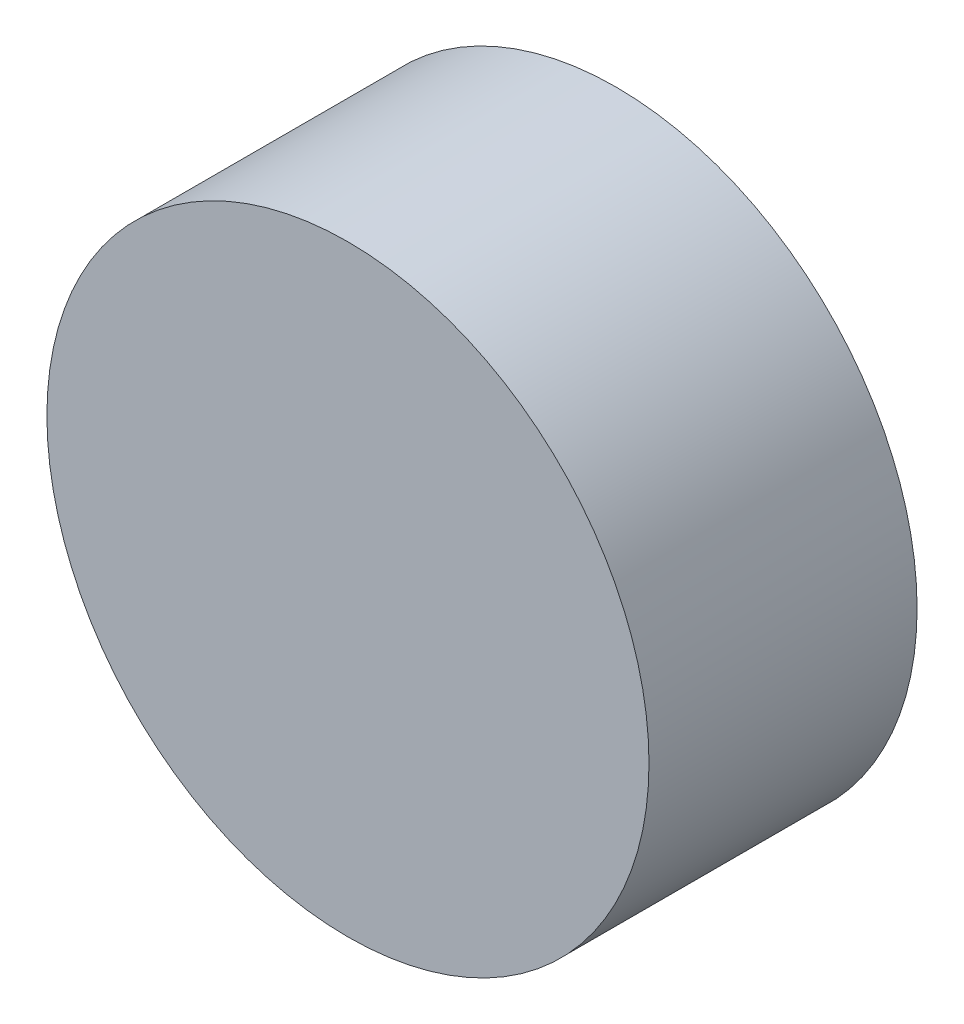
ISO-10303-21;
HEADER;
FILE_DESCRIPTION(('STEP AP214'),'2;1');
FILE_NAME('part.step','',(''),(''),'','','');
FILE_SCHEMA(('AUTOMOTIVE_DESIGN { 1 0 10303 214 1 1 1 1 }'));
ENDSEC;
DATA;
#1=APPLICATION_CONTEXT('core data for automotive mechanical design processes');
#2=APPLICATION_PROTOCOL_DEFINITION('international standard','automotive_design',2000,#1);
#3=PRODUCT_CONTEXT('',#1,'mechanical');
#4=PRODUCT('Part','Part','',(#3));
#5=PRODUCT_RELATED_PRODUCT_CATEGORY('part','',(#4));
#6=PRODUCT_DEFINITION_FORMATION('','',#4);
#7=PRODUCT_DEFINITION_CONTEXT('part definition',#1,'design');
#8=PRODUCT_DEFINITION('design','',#6,#7);
#9=PRODUCT_DEFINITION_SHAPE('','',#8);
#10=(LENGTH_UNIT() NAMED_UNIT(*) SI_UNIT(.MILLI.,.METRE.));
#11=(NAMED_UNIT(*) PLANE_ANGLE_UNIT() SI_UNIT($,.RADIAN.));
#12=(NAMED_UNIT(*) SI_UNIT($,.STERADIAN.) SOLID_ANGLE_UNIT());
#13=UNCERTAINTY_MEASURE_WITH_UNIT(LENGTH_MEASURE(1.E-05),#10,'distance_accuracy_value','');
#14=(GEOMETRIC_REPRESENTATION_CONTEXT(3) GLOBAL_UNCERTAINTY_ASSIGNED_CONTEXT((#13)) GLOBAL_UNIT_ASSIGNED_CONTEXT((#10,
#11,#12)) REPRESENTATION_CONTEXT('',''));
#15=CARTESIAN_POINT('',(0.,0.,0.));
#16=DIRECTION('',(0.,0.,1.));
#17=DIRECTION('',(1.,0.,0.));
#18=AXIS2_PLACEMENT_3D('',#15,#16,#17);
#19=CARTESIAN_POINT('',(-11.731,7.391,11.731));
#20=DIRECTION('',(0.,0.,-1.));
#21=DIRECTION('',(-1.,0.,0.));
#22=AXIS2_PLACEMENT_3D('',#19,#20,#21);
#23=CYLINDRICAL_SURFACE('',#22,13.173);
#24=CARTESIAN_POINT('',(-11.731,7.391,11.731));
#25=DIRECTION('',(0.,0.,1.));
#26=DIRECTION('',(1.,0.,0.));
#27=AXIS2_PLACEMENT_3D('',#24,#25,#26);
#28=CIRCLE('',#27,13.173);
#29=CARTESIAN_POINT('',(1.442,7.391,11.731));
#30=VERTEX_POINT('',#29);
#31=EDGE_CURVE('E10',#30,#30,#28,.T.);
#32=ORIENTED_EDGE('',*,*,#31,.F.);
#33=EDGE_LOOP('',(#32));
#34=FACE_BOUND('',#33,.T.);
#35=CARTESIAN_POINT('',(-11.731,7.391,0.));
#36=DIRECTION('',(0.,0.,1.));
#37=DIRECTION('',(1.,0.,0.));
#38=AXIS2_PLACEMENT_3D('',#35,#36,#37);
#39=CIRCLE('',#38,13.173);
#40=CARTESIAN_POINT('',(1.442,7.391,0.));
#41=VERTEX_POINT('',#40);
#42=EDGE_CURVE('E45',#41,#41,#39,.T.);
#43=ORIENTED_EDGE('',*,*,#42,.T.);
#44=EDGE_LOOP('',(#43));
#45=FACE_BOUND('',#44,.T.);
#46=ADVANCED_FACE('F39',(#34,#45),#23,.T.);
#47=CARTESIAN_POINT('',(-11.731,7.391,11.731));
#48=DIRECTION('',(0.,0.,1.));
#49=DIRECTION('',(1.,0.,0.));
#50=AXIS2_PLACEMENT_3D('',#47,#48,#49);
#51=PLANE('',#50);
#52=ORIENTED_EDGE('',*,*,#31,.T.);
#53=EDGE_LOOP('',(#52));
#54=FACE_BOUND('',#53,.T.);
#55=ADVANCED_FACE('F53',(#54),#51,.T.);
#56=CARTESIAN_POINT('',(-11.731,7.391,0.));
#57=DIRECTION('',(0.,0.,1.));
#58=DIRECTION('',(1.,0.,0.));
#59=AXIS2_PLACEMENT_3D('',#56,#57,#58);
#60=PLANE('',#59);
#61=ORIENTED_EDGE('',*,*,#42,.F.);
#62=EDGE_LOOP('',(#61));
#63=FACE_BOUND('',#62,.T.);
#64=ADVANCED_FACE('F55',(#63),#60,.F.);
#65=CLOSED_SHELL('',(#46,#55,#64));
#66=MANIFOLD_SOLID_BREP('B2',#65);
#67=ADVANCED_BREP_SHAPE_REPRESENTATION('',(#18,#66),#14);
#68=SHAPE_DEFINITION_REPRESENTATION(#9,#67);
ENDSEC;
END-ISO-10303-21;
